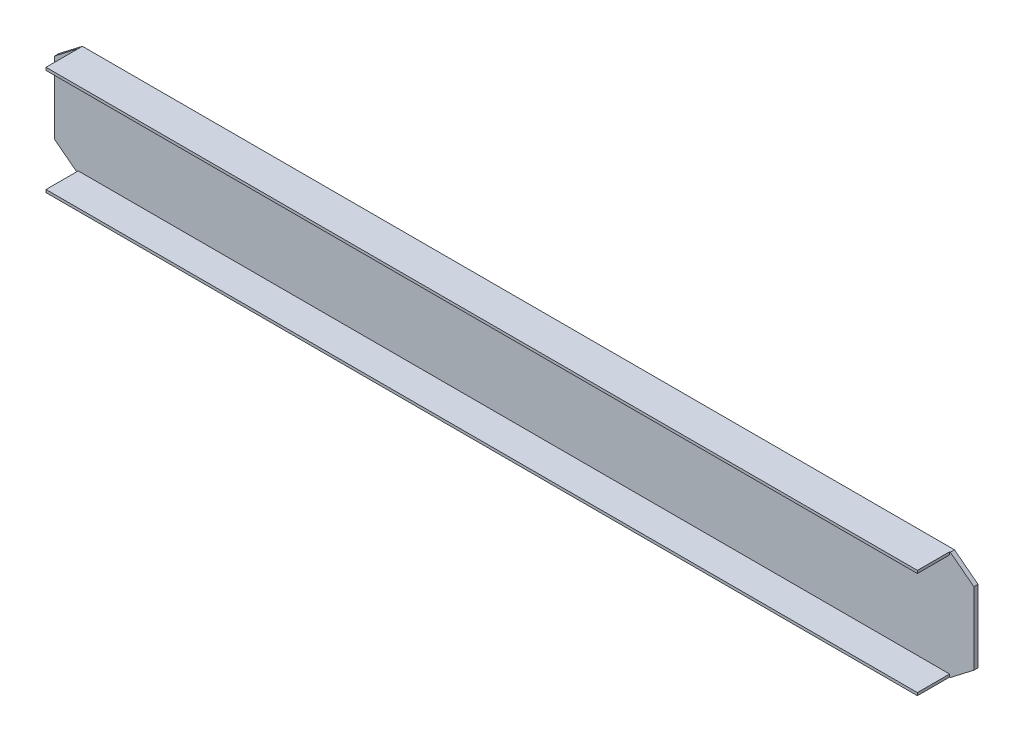
ISO-10303-21;
HEADER;
FILE_DESCRIPTION(('STEP AP214'),'2;1');
FILE_NAME('part.step','',(''),(''),'','','');
FILE_SCHEMA(('AUTOMOTIVE_DESIGN { 1 0 10303 214 1 1 1 1 }'));
ENDSEC;
DATA;
#1=APPLICATION_CONTEXT('core data for automotive mechanical design processes');
#2=APPLICATION_PROTOCOL_DEFINITION('international standard','automotive_design',2000,#1);
#3=PRODUCT_CONTEXT('',#1,'mechanical');
#4=PRODUCT('Part','Part','',(#3));
#5=PRODUCT_RELATED_PRODUCT_CATEGORY('part','',(#4));
#6=PRODUCT_DEFINITION_FORMATION('','',#4);
#7=PRODUCT_DEFINITION_CONTEXT('part definition',#1,'design');
#8=PRODUCT_DEFINITION('design','',#6,#7);
#9=PRODUCT_DEFINITION_SHAPE('','',#8);
#10=(LENGTH_UNIT() NAMED_UNIT(*) SI_UNIT(.MILLI.,.METRE.));
#11=(NAMED_UNIT(*) PLANE_ANGLE_UNIT() SI_UNIT($,.RADIAN.));
#12=(NAMED_UNIT(*) SI_UNIT($,.STERADIAN.) SOLID_ANGLE_UNIT());
#13=UNCERTAINTY_MEASURE_WITH_UNIT(LENGTH_MEASURE(1.E-05),#10,'distance_accuracy_value','');
#14=(GEOMETRIC_REPRESENTATION_CONTEXT(3) GLOBAL_UNCERTAINTY_ASSIGNED_CONTEXT((#13)) GLOBAL_UNIT_ASSIGNED_CONTEXT((#10,
#11,#12)) REPRESENTATION_CONTEXT('',''));
#15=CARTESIAN_POINT('',(0.,0.,0.));
#16=DIRECTION('',(0.,0.,1.));
#17=DIRECTION('',(1.,0.,0.));
#18=AXIS2_PLACEMENT_3D('',#15,#16,#17);
#19=CARTESIAN_POINT('',(0.,-926.923076923078,-11.5));
#20=DIRECTION('',(0.,0.,-1.));
#21=DIRECTION('',(-1.,0.,0.));
#22=AXIS2_PLACEMENT_3D('',#19,#20,#21);
#23=PLANE('',#22);
#24=DIRECTION('',(0.,-1.,0.));
#25=VECTOR('',#24,1.);
#26=CARTESIAN_POINT('',(-140.,270.,-11.5));
#27=LINE('',#26,#25);
#28=CARTESIAN_POINT('',(-140.,270.,-11.5));
#29=VERTEX_POINT('',#28);
#30=CARTESIAN_POINT('',(-140.,30.,-11.5));
#31=VERTEX_POINT('',#30);
#32=EDGE_CURVE('E265',#29,#31,#27,.T.);
#33=ORIENTED_EDGE('',*,*,#32,.F.);
#34=DIRECTION('',(1.,0.,0.));
#35=VECTOR('',#34,1.);
#36=CARTESIAN_POINT('',(-220.,270.,-11.5));
#37=LINE('',#36,#35);
#38=CARTESIAN_POINT('',(-220.,270.,-11.5));
#39=VERTEX_POINT('',#38);
#40=EDGE_CURVE('E262',#39,#29,#37,.T.);
#41=ORIENTED_EDGE('',*,*,#40,.F.);
#42=DIRECTION('',(0.,1.,0.));
#43=VECTOR('',#42,1.);
#44=CARTESIAN_POINT('',(-220.,270.,-11.5));
#45=LINE('',#44,#43);
#46=CARTESIAN_POINT('',(-220.,30.,-11.5));
#47=VERTEX_POINT('',#46);
#48=EDGE_CURVE('E274',#47,#39,#45,.T.);
#49=ORIENTED_EDGE('',*,*,#48,.F.);
#50=DIRECTION('',(-1.,0.,0.));
#51=VECTOR('',#50,1.);
#52=CARTESIAN_POINT('',(-220.,30.,-11.5));
#53=LINE('',#52,#51);
#54=EDGE_CURVE('E282',#31,#47,#53,.T.);
#55=ORIENTED_EDGE('',*,*,#54,.F.);
#56=EDGE_LOOP('',(#33,#41,#49,#55));
#57=FACE_BOUND('',#56,.T.);
#58=DIRECTION('',(-1.,0.,0.));
#59=VECTOR('',#58,1.);
#60=CARTESIAN_POINT('',(620.,30.,-11.5));
#61=LINE('',#60,#59);
#62=CARTESIAN_POINT('',(620.,30.,-11.5));
#63=VERTEX_POINT('',#62);
#64=CARTESIAN_POINT('',(540.,30.,-11.5));
#65=VERTEX_POINT('',#64);
#66=EDGE_CURVE('E336',#63,#65,#61,.T.);
#67=ORIENTED_EDGE('',*,*,#66,.F.);
#68=DIRECTION('',(0.,-1.,0.));
#69=VECTOR('',#68,1.);
#70=CARTESIAN_POINT('',(620.,270.,-11.5));
#71=LINE('',#70,#69);
#72=CARTESIAN_POINT('',(620.,270.,-11.5));
#73=VERTEX_POINT('',#72);
#74=EDGE_CURVE('E322',#73,#63,#71,.T.);
#75=ORIENTED_EDGE('',*,*,#74,.F.);
#76=DIRECTION('',(1.,0.,0.));
#77=VECTOR('',#76,1.);
#78=CARTESIAN_POINT('',(620.,270.,-11.5));
#79=LINE('',#78,#77);
#80=CARTESIAN_POINT('',(540.,270.,-11.5));
#81=VERTEX_POINT('',#80);
#82=EDGE_CURVE('E327',#81,#73,#79,.T.);
#83=ORIENTED_EDGE('',*,*,#82,.F.);
#84=DIRECTION('',(0.,1.,0.));
#85=VECTOR('',#84,1.);
#86=CARTESIAN_POINT('',(540.,270.,-11.5));
#87=LINE('',#86,#85);
#88=EDGE_CURVE('E338',#65,#81,#87,.T.);
#89=ORIENTED_EDGE('',*,*,#88,.F.);
#90=EDGE_LOOP('',(#67,#75,#83,#89));
#91=FACE_BOUND('',#90,.T.);
#92=DIRECTION('',(0.7926239891046,-0.609710760849693,0.));
#93=VECTOR('',#92,1.);
#94=CARTESIAN_POINT('',(-1270.,50.,-11.5));
#95=LINE('',#94,#93);
#96=CARTESIAN_POINT('',(-1270.,50.,-11.5));
#97=VERTEX_POINT('',#96);
#98=CARTESIAN_POINT('',(-1205.,0.,-11.5));
#99=VERTEX_POINT('',#98);
#100=EDGE_CURVE('E442',#97,#99,#95,.T.);
#101=ORIENTED_EDGE('',*,*,#100,.F.);
#102=DIRECTION('',(0.,-1.,0.));
#103=VECTOR('',#102,1.);
#104=CARTESIAN_POINT('',(-1270.,50.,-11.5));
#105=LINE('',#104,#103);
#106=CARTESIAN_POINT('',(-1270.,250.,-11.5));
#107=VERTEX_POINT('',#106);
#108=EDGE_CURVE('E457',#107,#97,#105,.T.);
#109=ORIENTED_EDGE('',*,*,#108,.F.);
#110=DIRECTION('',(-0.7926239891046,-0.609710760849693,0.));
#111=VECTOR('',#110,1.);
#112=CARTESIAN_POINT('',(-1270.,250.,-11.5));
#113=LINE('',#112,#111);
#114=CARTESIAN_POINT('',(-1205.,300.,-11.5));
#115=VERTEX_POINT('',#114);
#116=EDGE_CURVE('E463',#115,#107,#113,.T.);
#117=ORIENTED_EDGE('',*,*,#116,.F.);
#118=DIRECTION('',(-1.,0.,0.));
#119=VECTOR('',#118,1.);
#120=CARTESIAN_POINT('',(-1205.,300.,-11.5));
#121=LINE('',#120,#119);
#122=CARTESIAN_POINT('',(1205.,300.,-11.5));
#123=VERTEX_POINT('',#122);
#124=EDGE_CURVE('E428',#123,#115,#121,.T.);
#125=ORIENTED_EDGE('',*,*,#124,.F.);
#126=DIRECTION('',(-0.7926239891046,0.609710760849693,0.));
#127=VECTOR('',#126,1.);
#128=CARTESIAN_POINT('',(1270.,250.,-11.5));
#129=LINE('',#128,#127);
#130=CARTESIAN_POINT('',(1270.,250.,-11.5));
#131=VERTEX_POINT('',#130);
#132=EDGE_CURVE('E488',#131,#123,#129,.T.);
#133=ORIENTED_EDGE('',*,*,#132,.F.);
#134=DIRECTION('',(0.,1.,0.));
#135=VECTOR('',#134,1.);
#136=CARTESIAN_POINT('',(1270.,50.,-11.5));
#137=LINE('',#136,#135);
#138=CARTESIAN_POINT('',(1270.,50.,-11.5));
#139=VERTEX_POINT('',#138);
#140=EDGE_CURVE('E494',#139,#131,#137,.T.);
#141=ORIENTED_EDGE('',*,*,#140,.F.);
#142=DIRECTION('',(0.7926239891046,0.609710760849693,0.));
#143=VECTOR('',#142,1.);
#144=CARTESIAN_POINT('',(1270.,50.,-11.5));
#145=LINE('',#144,#143);
#146=CARTESIAN_POINT('',(1205.,0.,-11.5));
#147=VERTEX_POINT('',#146);
#148=EDGE_CURVE('E498',#147,#139,#145,.T.);
#149=ORIENTED_EDGE('',*,*,#148,.F.);
#150=DIRECTION('',(1.,0.,0.));
#151=VECTOR('',#150,1.);
#152=CARTESIAN_POINT('',(-1205.,0.,-11.5));
#153=LINE('',#152,#151);
#154=EDGE_CURVE('E501',#99,#147,#153,.T.);
#155=ORIENTED_EDGE('',*,*,#154,.F.);
#156=EDGE_LOOP('',(#101,#109,#117,#125,#133,#141,#149,#155));
#157=FACE_BOUND('',#156,.T.);
#158=DIRECTION('',(-1.,0.,0.));
#159=VECTOR('',#158,1.);
#160=CARTESIAN_POINT('',(220.,30.,-11.5));
#161=LINE('',#160,#159);
#162=CARTESIAN_POINT('',(220.,30.,-11.5));
#163=VERTEX_POINT('',#162);
#164=CARTESIAN_POINT('',(140.,30.,-11.5));
#165=VERTEX_POINT('',#164);
#166=EDGE_CURVE('E307',#163,#165,#161,.T.);
#167=ORIENTED_EDGE('',*,*,#166,.F.);
#168=DIRECTION('',(0.,-1.,0.));
#169=VECTOR('',#168,1.);
#170=CARTESIAN_POINT('',(220.,270.,-11.5));
#171=LINE('',#170,#169);
#172=CARTESIAN_POINT('',(220.,270.,-11.5));
#173=VERTEX_POINT('',#172);
#174=EDGE_CURVE('E293',#173,#163,#171,.T.);
#175=ORIENTED_EDGE('',*,*,#174,.F.);
#176=DIRECTION('',(1.,0.,0.));
#177=VECTOR('',#176,1.);
#178=CARTESIAN_POINT('',(220.,270.,-11.5));
#179=LINE('',#178,#177);
#180=CARTESIAN_POINT('',(140.,270.,-11.5));
#181=VERTEX_POINT('',#180);
#182=EDGE_CURVE('E298',#181,#173,#179,.T.);
#183=ORIENTED_EDGE('',*,*,#182,.F.);
#184=DIRECTION('',(0.,1.,0.));
#185=VECTOR('',#184,1.);
#186=CARTESIAN_POINT('',(140.,270.,-11.5));
#187=LINE('',#186,#185);
#188=EDGE_CURVE('E309',#165,#181,#187,.T.);
#189=ORIENTED_EDGE('',*,*,#188,.F.);
#190=EDGE_LOOP('',(#167,#175,#183,#189));
#191=FACE_BOUND('',#190,.T.);
#192=DIRECTION('',(0.,-1.,0.));
#193=VECTOR('',#192,1.);
#194=CARTESIAN_POINT('',(-540.,270.,-11.5));
#195=LINE('',#194,#193);
#196=CARTESIAN_POINT('',(-540.,270.,-11.5));
#197=VERTEX_POINT('',#196);
#198=CARTESIAN_POINT('',(-540.,30.,-11.5));
#199=VERTEX_POINT('',#198);
#200=EDGE_CURVE('E889',#197,#199,#195,.T.);
#201=ORIENTED_EDGE('',*,*,#200,.F.);
#202=DIRECTION('',(1.,0.,0.));
#203=VECTOR('',#202,1.);
#204=CARTESIAN_POINT('',(-620.,270.,-11.5));
#205=LINE('',#204,#203);
#206=CARTESIAN_POINT('',(-620.,270.,-11.5));
#207=VERTEX_POINT('',#206);
#208=EDGE_CURVE('E260',#207,#197,#205,.T.);
#209=ORIENTED_EDGE('',*,*,#208,.F.);
#210=DIRECTION('',(0.,1.,0.));
#211=VECTOR('',#210,1.);
#212=CARTESIAN_POINT('',(-620.,270.,-11.5));
#213=LINE('',#212,#211);
#214=CARTESIAN_POINT('',(-620.,30.,-11.5));
#215=VERTEX_POINT('',#214);
#216=EDGE_CURVE('E256',#215,#207,#213,.T.);
#217=ORIENTED_EDGE('',*,*,#216,.F.);
#218=DIRECTION('',(-1.,0.,0.));
#219=VECTOR('',#218,1.);
#220=CARTESIAN_POINT('',(-620.,30.,-11.5));
#221=LINE('',#220,#219);
#222=EDGE_CURVE('E886',#199,#215,#221,.T.);
#223=ORIENTED_EDGE('',*,*,#222,.F.);
#224=EDGE_LOOP('',(#201,#209,#217,#223));
#225=FACE_BOUND('',#224,.T.);
#226=ADVANCED_FACE('F32',(#57,#91,#157,#191,#225),#23,.T.);
#227=CARTESIAN_POINT('',(0.,-926.923076923078,0.));
#228=DIRECTION('',(0.,0.,-1.));
#229=DIRECTION('',(-1.,0.,0.));
#230=AXIS2_PLACEMENT_3D('',#227,#228,#229);
#231=PLANE('',#230);
#232=DIRECTION('',(0.,1.,0.));
#233=VECTOR('',#232,1.);
#234=CARTESIAN_POINT('',(1203.04903416362,0.,0.));
#235=LINE('',#234,#233);
#236=CARTESIAN_POINT('',(1203.04903416362,0.,0.));
#237=VERTEX_POINT('',#236);
#238=CARTESIAN_POINT('',(1203.04903416362,7.49999999999995,0.));
#239=VERTEX_POINT('',#238);
#240=EDGE_CURVE('E351',#237,#239,#235,.T.);
#241=ORIENTED_EDGE('',*,*,#240,.F.);
#242=DIRECTION('',(1.,0.,0.));
#243=VECTOR('',#242,1.);
#244=CARTESIAN_POINT('',(-1205.,0.,0.));
#245=LINE('',#244,#243);
#246=CARTESIAN_POINT('',(1205.,0.,0.));
#247=VERTEX_POINT('',#246);
#248=EDGE_CURVE('E472',#237,#247,#245,.T.);
#249=ORIENTED_EDGE('',*,*,#248,.T.);
#250=DIRECTION('',(0.7926239891046,0.609710760849693,0.));
#251=VECTOR('',#250,1.);
#252=CARTESIAN_POINT('',(1270.,50.,0.));
#253=LINE('',#252,#251);
#254=CARTESIAN_POINT('',(1270.,50.,0.));
#255=VERTEX_POINT('',#254);
#256=EDGE_CURVE('E474',#247,#255,#253,.T.);
#257=ORIENTED_EDGE('',*,*,#256,.T.);
#258=DIRECTION('',(0.,1.,0.));
#259=VECTOR('',#258,1.);
#260=CARTESIAN_POINT('',(1270.,50.,0.));
#261=LINE('',#260,#259);
#262=CARTESIAN_POINT('',(1270.,250.,0.));
#263=VERTEX_POINT('',#262);
#264=EDGE_CURVE('E477',#255,#263,#261,.T.);
#265=ORIENTED_EDGE('',*,*,#264,.T.);
#266=DIRECTION('',(-0.7926239891046,0.609710760849693,0.));
#267=VECTOR('',#266,1.);
#268=CARTESIAN_POINT('',(1270.,250.,0.));
#269=LINE('',#268,#267);
#270=CARTESIAN_POINT('',(1205.,300.,0.));
#271=VERTEX_POINT('',#270);
#272=EDGE_CURVE('E444',#263,#271,#269,.T.);
#273=ORIENTED_EDGE('',*,*,#272,.T.);
#274=DIRECTION('',(-1.,0.,0.));
#275=VECTOR('',#274,1.);
#276=CARTESIAN_POINT('',(-1205.,300.,0.));
#277=LINE('',#276,#275);
#278=CARTESIAN_POINT('',(1203.04903416362,300.,0.));
#279=VERTEX_POINT('',#278);
#280=EDGE_CURVE('E404',#271,#279,#277,.T.);
#281=ORIENTED_EDGE('',*,*,#280,.T.);
#282=DIRECTION('',(0.,1.,0.));
#283=VECTOR('',#282,1.);
#284=CARTESIAN_POINT('',(1203.04903416362,300.,0.));
#285=LINE('',#284,#283);
#286=CARTESIAN_POINT('',(1203.04903416362,292.5,0.));
#287=VERTEX_POINT('',#286);
#288=EDGE_CURVE('E386',#287,#279,#285,.T.);
#289=ORIENTED_EDGE('',*,*,#288,.F.);
#290=DIRECTION('',(1.,0.,0.));
#291=VECTOR('',#290,1.);
#292=CARTESIAN_POINT('',(-1205.,292.5,0.));
#293=LINE('',#292,#291);
#294=CARTESIAN_POINT('',(-1205.,292.5,0.));
#295=VERTEX_POINT('',#294);
#296=EDGE_CURVE('E395',#295,#287,#293,.T.);
#297=ORIENTED_EDGE('',*,*,#296,.F.);
#298=DIRECTION('',(0.,-1.,0.));
#299=VECTOR('',#298,1.);
#300=CARTESIAN_POINT('',(-1205.,300.,0.));
#301=LINE('',#300,#299);
#302=CARTESIAN_POINT('',(-1205.,300.,0.));
#303=VERTEX_POINT('',#302);
#304=EDGE_CURVE('E381',#303,#295,#301,.T.);
#305=ORIENTED_EDGE('',*,*,#304,.F.);
#306=DIRECTION('',(-0.7926239891046,-0.609710760849693,0.));
#307=VECTOR('',#306,1.);
#308=CARTESIAN_POINT('',(-1270.,250.,0.));
#309=LINE('',#308,#307);
#310=CARTESIAN_POINT('',(-1270.,250.,0.));
#311=VERTEX_POINT('',#310);
#312=EDGE_CURVE('E435',#303,#311,#309,.T.);
#313=ORIENTED_EDGE('',*,*,#312,.T.);
#314=DIRECTION('',(0.,-1.,0.));
#315=VECTOR('',#314,1.);
#316=CARTESIAN_POINT('',(-1270.,50.,0.));
#317=LINE('',#316,#315);
#318=CARTESIAN_POINT('',(-1270.,50.,0.));
#319=VERTEX_POINT('',#318);
#320=EDGE_CURVE('E440',#311,#319,#317,.T.);
#321=ORIENTED_EDGE('',*,*,#320,.T.);
#322=DIRECTION('',(0.7926239891046,-0.609710760849693,0.));
#323=VECTOR('',#322,1.);
#324=CARTESIAN_POINT('',(-1270.,50.,0.));
#325=LINE('',#324,#323);
#326=CARTESIAN_POINT('',(-1205.,0.,0.));
#327=VERTEX_POINT('',#326);
#328=EDGE_CURVE('E470',#319,#327,#325,.T.);
#329=ORIENTED_EDGE('',*,*,#328,.T.);
#330=DIRECTION('',(0.,-1.,0.));
#331=VECTOR('',#330,1.);
#332=CARTESIAN_POINT('',(-1205.,0.,0.));
#333=LINE('',#332,#331);
#334=CARTESIAN_POINT('',(-1205.,7.49999999999995,0.));
#335=VERTEX_POINT('',#334);
#336=EDGE_CURVE('E356',#335,#327,#333,.T.);
#337=ORIENTED_EDGE('',*,*,#336,.F.);
#338=DIRECTION('',(-1.,0.,0.));
#339=VECTOR('',#338,1.);
#340=CARTESIAN_POINT('',(-1205.,7.49999999999995,0.));
#341=LINE('',#340,#339);
#342=EDGE_CURVE('E365',#239,#335,#341,.T.);
#343=ORIENTED_EDGE('',*,*,#342,.F.);
#344=EDGE_LOOP('',(#241,#249,#257,#265,#273,#281,#289,#297,#305,#313,#321,#329,#337,#343));
#345=FACE_BOUND('',#344,.T.);
#346=ADVANCED_FACE('F482',(#345),#231,.F.);
#347=CARTESIAN_POINT('',(-1270.,50.,-11.5));
#348=DIRECTION('',(-0.609710760849693,-0.7926239891046,0.));
#349=DIRECTION('',(0.7926239891046,-0.609710760849693,0.));
#350=AXIS2_PLACEMENT_3D('',#347,#348,#349);
#351=PLANE('',#350);
#352=ORIENTED_EDGE('',*,*,#328,.F.);
#353=DIRECTION('',(0.,0.,1.));
#354=VECTOR('',#353,1.);
#355=CARTESIAN_POINT('',(-1270.,50.,-11.5));
#356=LINE('',#355,#354);
#357=EDGE_CURVE('E11',#97,#319,#356,.T.);
#358=ORIENTED_EDGE('',*,*,#357,.F.);
#359=ORIENTED_EDGE('',*,*,#100,.T.);
#360=DIRECTION('',(0.,0.,1.));
#361=VECTOR('',#360,1.);
#362=CARTESIAN_POINT('',(-1205.,0.,-11.5));
#363=LINE('',#362,#361);
#364=EDGE_CURVE('E456',#99,#327,#363,.T.);
#365=ORIENTED_EDGE('',*,*,#364,.T.);
#366=EDGE_LOOP('',(#352,#358,#359,#365));
#367=FACE_BOUND('',#366,.T.);
#368=ADVANCED_FACE('F34',(#367),#351,.T.);
#369=CARTESIAN_POINT('',(-1270.,50.,-11.5));
#370=DIRECTION('',(-1.,0.,0.));
#371=DIRECTION('',(0.,0.,1.));
#372=AXIS2_PLACEMENT_3D('',#369,#370,#371);
#373=PLANE('',#372);
#374=ORIENTED_EDGE('',*,*,#320,.F.);
#375=DIRECTION('',(0.,0.,1.));
#376=VECTOR('',#375,1.);
#377=CARTESIAN_POINT('',(-1270.,250.,-11.5));
#378=LINE('',#377,#376);
#379=EDGE_CURVE('E41',#107,#311,#378,.T.);
#380=ORIENTED_EDGE('',*,*,#379,.F.);
#381=ORIENTED_EDGE('',*,*,#108,.T.);
#382=ORIENTED_EDGE('',*,*,#357,.T.);
#383=EDGE_LOOP('',(#374,#380,#381,#382));
#384=FACE_BOUND('',#383,.T.);
#385=ADVANCED_FACE('F534',(#384),#373,.T.);
#386=CARTESIAN_POINT('',(-1270.,250.,-11.5));
#387=DIRECTION('',(-0.609710760849693,0.7926239891046,0.));
#388=DIRECTION('',(-0.7926239891046,-0.609710760849693,0.));
#389=AXIS2_PLACEMENT_3D('',#386,#387,#388);
#390=PLANE('',#389);
#391=ORIENTED_EDGE('',*,*,#312,.F.);
#392=DIRECTION('',(0.,0.,1.));
#393=VECTOR('',#392,1.);
#394=CARTESIAN_POINT('',(-1205.,300.,-11.5));
#395=LINE('',#394,#393);
#396=EDGE_CURVE('E425',#115,#303,#395,.T.);
#397=ORIENTED_EDGE('',*,*,#396,.F.);
#398=ORIENTED_EDGE('',*,*,#116,.T.);
#399=ORIENTED_EDGE('',*,*,#379,.T.);
#400=EDGE_LOOP('',(#391,#397,#398,#399));
#401=FACE_BOUND('',#400,.T.);
#402=ADVANCED_FACE('F436',(#401),#390,.T.);
#403=CARTESIAN_POINT('',(-1205.,300.,-11.5));
#404=DIRECTION('',(0.,1.,0.));
#405=DIRECTION('',(0.,0.,1.));
#406=AXIS2_PLACEMENT_3D('',#403,#404,#405);
#407=PLANE('',#406);
#408=ORIENTED_EDGE('',*,*,#280,.F.);
#409=DIRECTION('',(0.,0.,1.));
#410=VECTOR('',#409,1.);
#411=CARTESIAN_POINT('',(1205.,300.,-11.5));
#412=LINE('',#411,#410);
#413=EDGE_CURVE('E432',#123,#271,#412,.T.);
#414=ORIENTED_EDGE('',*,*,#413,.F.);
#415=ORIENTED_EDGE('',*,*,#124,.T.);
#416=ORIENTED_EDGE('',*,*,#396,.T.);
#417=DIRECTION('',(0.,0.,-1.));
#418=VECTOR('',#417,1.);
#419=CARTESIAN_POINT('',(-1205.,300.,89.));
#420=LINE('',#419,#418);
#421=CARTESIAN_POINT('',(-1205.,300.,89.));
#422=VERTEX_POINT('',#421);
#423=EDGE_CURVE('E392',#422,#303,#420,.T.);
#424=ORIENTED_EDGE('',*,*,#423,.F.);
#425=DIRECTION('',(-1.,0.,0.));
#426=VECTOR('',#425,1.);
#427=CARTESIAN_POINT('',(-1205.,300.,89.));
#428=LINE('',#427,#426);
#429=CARTESIAN_POINT('',(1203.04903416362,300.,89.));
#430=VERTEX_POINT('',#429);
#431=EDGE_CURVE('E390',#430,#422,#428,.T.);
#432=ORIENTED_EDGE('',*,*,#431,.F.);
#433=DIRECTION('',(0.,0.,-1.));
#434=VECTOR('',#433,1.);
#435=CARTESIAN_POINT('',(1203.04903416362,300.,89.));
#436=LINE('',#435,#434);
#437=EDGE_CURVE('E407',#430,#279,#436,.T.);
#438=ORIENTED_EDGE('',*,*,#437,.T.);
#439=EDGE_LOOP('',(#408,#414,#415,#416,#424,#432,#438));
#440=FACE_BOUND('',#439,.T.);
#441=ADVANCED_FACE('F423',(#440),#407,.T.);
#442=CARTESIAN_POINT('',(1270.,250.,-11.5));
#443=DIRECTION('',(0.609710760849693,0.7926239891046,0.));
#444=DIRECTION('',(-0.7926239891046,0.609710760849693,0.));
#445=AXIS2_PLACEMENT_3D('',#442,#443,#444);
#446=PLANE('',#445);
#447=ORIENTED_EDGE('',*,*,#272,.F.);
#448=DIRECTION('',(0.,0.,1.));
#449=VECTOR('',#448,1.);
#450=CARTESIAN_POINT('',(1270.,250.,-11.5));
#451=LINE('',#450,#449);
#452=EDGE_CURVE('E450',#131,#263,#451,.T.);
#453=ORIENTED_EDGE('',*,*,#452,.F.);
#454=ORIENTED_EDGE('',*,*,#132,.T.);
#455=ORIENTED_EDGE('',*,*,#413,.T.);
#456=EDGE_LOOP('',(#447,#453,#454,#455));
#457=FACE_BOUND('',#456,.T.);
#458=ADVANCED_FACE('F485',(#457),#446,.T.);
#459=CARTESIAN_POINT('',(1270.,50.,-11.5));
#460=DIRECTION('',(1.,0.,0.));
#461=DIRECTION('',(0.,0.,-1.));
#462=AXIS2_PLACEMENT_3D('',#459,#460,#461);
#463=PLANE('',#462);
#464=ORIENTED_EDGE('',*,*,#264,.F.);
#465=DIRECTION('',(0.,0.,1.));
#466=VECTOR('',#465,1.);
#467=CARTESIAN_POINT('',(1270.,50.,-11.5));
#468=LINE('',#467,#466);
#469=EDGE_CURVE('E452',#139,#255,#468,.T.);
#470=ORIENTED_EDGE('',*,*,#469,.F.);
#471=ORIENTED_EDGE('',*,*,#140,.T.);
#472=ORIENTED_EDGE('',*,*,#452,.T.);
#473=EDGE_LOOP('',(#464,#470,#471,#472));
#474=FACE_BOUND('',#473,.T.);
#475=ADVANCED_FACE('F543',(#474),#463,.T.);
#476=CARTESIAN_POINT('',(1270.,50.,-11.5));
#477=DIRECTION('',(0.609710760849693,-0.7926239891046,0.));
#478=DIRECTION('',(0.7926239891046,0.609710760849693,0.));
#479=AXIS2_PLACEMENT_3D('',#476,#477,#478);
#480=PLANE('',#479);
#481=ORIENTED_EDGE('',*,*,#256,.F.);
#482=DIRECTION('',(0.,0.,1.));
#483=VECTOR('',#482,1.);
#484=CARTESIAN_POINT('',(1205.,0.,-11.5));
#485=LINE('',#484,#483);
#486=EDGE_CURVE('E454',#147,#247,#485,.T.);
#487=ORIENTED_EDGE('',*,*,#486,.F.);
#488=ORIENTED_EDGE('',*,*,#148,.T.);
#489=ORIENTED_EDGE('',*,*,#469,.T.);
#490=EDGE_LOOP('',(#481,#487,#488,#489));
#491=FACE_BOUND('',#490,.T.);
#492=ADVANCED_FACE('F546',(#491),#480,.T.);
#493=CARTESIAN_POINT('',(-1205.,0.,-11.5));
#494=DIRECTION('',(0.,-1.,0.));
#495=DIRECTION('',(0.,0.,-1.));
#496=AXIS2_PLACEMENT_3D('',#493,#494,#495);
#497=PLANE('',#496);
#498=ORIENTED_EDGE('',*,*,#248,.F.);
#499=DIRECTION('',(0.,0.,-1.));
#500=VECTOR('',#499,1.);
#501=CARTESIAN_POINT('',(1203.04903416362,0.,89.));
#502=LINE('',#501,#500);
#503=CARTESIAN_POINT('',(1203.04903416362,0.,89.));
#504=VERTEX_POINT('',#503);
#505=EDGE_CURVE('E378',#504,#237,#502,.T.);
#506=ORIENTED_EDGE('',*,*,#505,.F.);
#507=DIRECTION('',(1.,0.,0.));
#508=VECTOR('',#507,1.);
#509=CARTESIAN_POINT('',(-1205.,0.,89.));
#510=LINE('',#509,#508);
#511=CARTESIAN_POINT('',(-1205.,0.,89.));
#512=VERTEX_POINT('',#511);
#513=EDGE_CURVE('E352',#512,#504,#510,.T.);
#514=ORIENTED_EDGE('',*,*,#513,.F.);
#515=DIRECTION('',(0.,0.,-1.));
#516=VECTOR('',#515,1.);
#517=CARTESIAN_POINT('',(-1205.,0.,89.));
#518=LINE('',#517,#516);
#519=EDGE_CURVE('E362',#512,#327,#518,.T.);
#520=ORIENTED_EDGE('',*,*,#519,.T.);
#521=ORIENTED_EDGE('',*,*,#364,.F.);
#522=ORIENTED_EDGE('',*,*,#154,.T.);
#523=ORIENTED_EDGE('',*,*,#486,.T.);
#524=EDGE_LOOP('',(#498,#506,#514,#520,#521,#522,#523));
#525=FACE_BOUND('',#524,.T.);
#526=ADVANCED_FACE('F549',(#525),#497,.T.);
#527=CARTESIAN_POINT('',(-1205.,300.,89.));
#528=DIRECTION('',(1.,0.,0.));
#529=DIRECTION('',(0.,0.,-1.));
#530=AXIS2_PLACEMENT_3D('',#527,#528,#529);
#531=PLANE('',#530);
#532=ORIENTED_EDGE('',*,*,#304,.T.);
#533=DIRECTION('',(0.,0.,-1.));
#534=VECTOR('',#533,1.);
#535=CARTESIAN_POINT('',(-1205.,292.5,89.));
#536=LINE('',#535,#534);
#537=CARTESIAN_POINT('',(-1205.,292.5,89.));
#538=VERTEX_POINT('',#537);
#539=EDGE_CURVE('E415',#538,#295,#536,.T.);
#540=ORIENTED_EDGE('',*,*,#539,.F.);
#541=DIRECTION('',(0.,-1.,0.));
#542=VECTOR('',#541,1.);
#543=CARTESIAN_POINT('',(-1205.,300.,89.));
#544=LINE('',#543,#542);
#545=EDGE_CURVE('E382',#422,#538,#544,.T.);
#546=ORIENTED_EDGE('',*,*,#545,.F.);
#547=ORIENTED_EDGE('',*,*,#423,.T.);
#548=EDGE_LOOP('',(#532,#540,#546,#547));
#549=FACE_BOUND('',#548,.T.);
#550=ADVANCED_FACE('F420',(#549),#531,.F.);
#551=CARTESIAN_POINT('',(-1205.,292.5,89.));
#552=DIRECTION('',(0.,1.,0.));
#553=DIRECTION('',(0.,0.,1.));
#554=AXIS2_PLACEMENT_3D('',#551,#552,#553);
#555=PLANE('',#554);
#556=ORIENTED_EDGE('',*,*,#296,.T.);
#557=DIRECTION('',(0.,0.,-1.));
#558=VECTOR('',#557,1.);
#559=CARTESIAN_POINT('',(1203.04903416362,292.5,89.));
#560=LINE('',#559,#558);
#561=CARTESIAN_POINT('',(1203.04903416362,292.5,89.));
#562=VERTEX_POINT('',#561);
#563=EDGE_CURVE('E409',#562,#287,#560,.T.);
#564=ORIENTED_EDGE('',*,*,#563,.F.);
#565=DIRECTION('',(1.,0.,0.));
#566=VECTOR('',#565,1.);
#567=CARTESIAN_POINT('',(-1205.,292.5,89.));
#568=LINE('',#567,#566);
#569=EDGE_CURVE('E385',#538,#562,#568,.T.);
#570=ORIENTED_EDGE('',*,*,#569,.F.);
#571=ORIENTED_EDGE('',*,*,#539,.T.);
#572=EDGE_LOOP('',(#556,#564,#570,#571));
#573=FACE_BOUND('',#572,.T.);
#574=ADVANCED_FACE('F507',(#573),#555,.F.);
#575=CARTESIAN_POINT('',(1203.04903416362,300.,89.));
#576=DIRECTION('',(-1.,0.,0.));
#577=DIRECTION('',(0.,0.,1.));
#578=AXIS2_PLACEMENT_3D('',#575,#576,#577);
#579=PLANE('',#578);
#580=ORIENTED_EDGE('',*,*,#288,.T.);
#581=ORIENTED_EDGE('',*,*,#437,.F.);
#582=DIRECTION('',(0.,1.,0.));
#583=VECTOR('',#582,1.);
#584=CARTESIAN_POINT('',(1203.04903416362,300.,89.));
#585=LINE('',#584,#583);
#586=EDGE_CURVE('E388',#562,#430,#585,.T.);
#587=ORIENTED_EDGE('',*,*,#586,.F.);
#588=ORIENTED_EDGE('',*,*,#563,.T.);
#589=EDGE_LOOP('',(#580,#581,#587,#588));
#590=FACE_BOUND('',#589,.T.);
#591=ADVANCED_FACE('F513',(#590),#579,.F.);
#592=CARTESIAN_POINT('',(-1205.,292.5,89.));
#593=DIRECTION('',(0.,0.,1.));
#594=DIRECTION('',(1.,0.,0.));
#595=AXIS2_PLACEMENT_3D('',#592,#593,#594);
#596=PLANE('',#595);
#597=ORIENTED_EDGE('',*,*,#545,.T.);
#598=ORIENTED_EDGE('',*,*,#569,.T.);
#599=ORIENTED_EDGE('',*,*,#586,.T.);
#600=ORIENTED_EDGE('',*,*,#431,.T.);
#601=EDGE_LOOP('',(#597,#598,#599,#600));
#602=FACE_BOUND('',#601,.T.);
#603=ADVANCED_FACE('F511',(#602),#596,.T.);
#604=CARTESIAN_POINT('',(1203.04903416362,0.,89.));
#605=DIRECTION('',(-1.,0.,0.));
#606=DIRECTION('',(0.,0.,1.));
#607=AXIS2_PLACEMENT_3D('',#604,#605,#606);
#608=PLANE('',#607);
#609=ORIENTED_EDGE('',*,*,#240,.T.);
#610=DIRECTION('',(0.,0.,-1.));
#611=VECTOR('',#610,1.);
#612=CARTESIAN_POINT('',(1203.04903416362,7.49999999999995,89.));
#613=LINE('',#612,#611);
#614=CARTESIAN_POINT('',(1203.04903416362,7.49999999999995,89.));
#615=VERTEX_POINT('',#614);
#616=EDGE_CURVE('E375',#615,#239,#613,.T.);
#617=ORIENTED_EDGE('',*,*,#616,.F.);
#618=DIRECTION('',(0.,1.,0.));
#619=VECTOR('',#618,1.);
#620=CARTESIAN_POINT('',(1203.04903416362,0.,89.));
#621=LINE('',#620,#619);
#622=EDGE_CURVE('E355',#504,#615,#621,.T.);
#623=ORIENTED_EDGE('',*,*,#622,.F.);
#624=ORIENTED_EDGE('',*,*,#505,.T.);
#625=EDGE_LOOP('',(#609,#617,#623,#624));
#626=FACE_BOUND('',#625,.T.);
#627=ADVANCED_FACE('F520',(#626),#608,.F.);
#628=CARTESIAN_POINT('',(-1205.,7.49999999999995,89.));
#629=DIRECTION('',(0.,-1.,0.));
#630=DIRECTION('',(0.,0.,-1.));
#631=AXIS2_PLACEMENT_3D('',#628,#629,#630);
#632=PLANE('',#631);
#633=ORIENTED_EDGE('',*,*,#342,.T.);
#634=DIRECTION('',(0.,0.,-1.));
#635=VECTOR('',#634,1.);
#636=CARTESIAN_POINT('',(-1205.,7.49999999999995,89.));
#637=LINE('',#636,#635);
#638=CARTESIAN_POINT('',(-1205.,7.49999999999995,89.));
#639=VERTEX_POINT('',#638);
#640=EDGE_CURVE('E372',#639,#335,#637,.T.);
#641=ORIENTED_EDGE('',*,*,#640,.F.);
#642=DIRECTION('',(-1.,0.,0.));
#643=VECTOR('',#642,1.);
#644=CARTESIAN_POINT('',(-1205.,7.49999999999995,89.));
#645=LINE('',#644,#643);
#646=EDGE_CURVE('E358',#615,#639,#645,.T.);
#647=ORIENTED_EDGE('',*,*,#646,.F.);
#648=ORIENTED_EDGE('',*,*,#616,.T.);
#649=EDGE_LOOP('',(#633,#641,#647,#648));
#650=FACE_BOUND('',#649,.T.);
#651=ADVANCED_FACE('F571',(#650),#632,.F.);
#652=CARTESIAN_POINT('',(-1205.,0.,89.));
#653=DIRECTION('',(1.,0.,0.));
#654=DIRECTION('',(0.,0.,-1.));
#655=AXIS2_PLACEMENT_3D('',#652,#653,#654);
#656=PLANE('',#655);
#657=ORIENTED_EDGE('',*,*,#336,.T.);
#658=ORIENTED_EDGE('',*,*,#519,.F.);
#659=DIRECTION('',(0.,-1.,0.));
#660=VECTOR('',#659,1.);
#661=CARTESIAN_POINT('',(-1205.,0.,89.));
#662=LINE('',#661,#660);
#663=EDGE_CURVE('E360',#639,#512,#662,.T.);
#664=ORIENTED_EDGE('',*,*,#663,.F.);
#665=ORIENTED_EDGE('',*,*,#640,.T.);
#666=EDGE_LOOP('',(#657,#658,#664,#665));
#667=FACE_BOUND('',#666,.T.);
#668=ADVANCED_FACE('F568',(#667),#656,.F.);
#669=CARTESIAN_POINT('',(1203.04903416362,0.,89.));
#670=DIRECTION('',(0.,0.,1.));
#671=DIRECTION('',(1.,0.,0.));
#672=AXIS2_PLACEMENT_3D('',#669,#670,#671);
#673=PLANE('',#672);
#674=ORIENTED_EDGE('',*,*,#513,.T.);
#675=ORIENTED_EDGE('',*,*,#622,.T.);
#676=ORIENTED_EDGE('',*,*,#646,.T.);
#677=ORIENTED_EDGE('',*,*,#663,.T.);
#678=EDGE_LOOP('',(#674,#675,#676,#677));
#679=FACE_BOUND('',#678,.T.);
#680=ADVANCED_FACE('F563',(#679),#673,.T.);
#681=CARTESIAN_POINT('',(620.,270.,-27.5));
#682=DIRECTION('',(-1.,0.,0.));
#683=DIRECTION('',(0.,0.,1.));
#684=AXIS2_PLACEMENT_3D('',#681,#682,#683);
#685=PLANE('',#684);
#686=ORIENTED_EDGE('',*,*,#74,.T.);
#687=DIRECTION('',(0.,0.,1.));
#688=VECTOR('',#687,1.);
#689=CARTESIAN_POINT('',(620.,30.,-27.5));
#690=LINE('',#689,#688);
#691=CARTESIAN_POINT('',(620.,30.,-27.5));
#692=VERTEX_POINT('',#691);
#693=EDGE_CURVE('E349',#692,#63,#690,.T.);
#694=ORIENTED_EDGE('',*,*,#693,.F.);
#695=DIRECTION('',(0.,-1.,0.));
#696=VECTOR('',#695,1.);
#697=CARTESIAN_POINT('',(620.,270.,-27.5));
#698=LINE('',#697,#696);
#699=CARTESIAN_POINT('',(620.,270.,-27.5));
#700=VERTEX_POINT('',#699);
#701=EDGE_CURVE('E323',#700,#692,#698,.T.);
#702=ORIENTED_EDGE('',*,*,#701,.F.);
#703=DIRECTION('',(0.,0.,1.));
#704=VECTOR('',#703,1.);
#705=CARTESIAN_POINT('',(620.,270.,-27.5));
#706=LINE('',#705,#704);
#707=EDGE_CURVE('E333',#700,#73,#706,.T.);
#708=ORIENTED_EDGE('',*,*,#707,.T.);
#709=EDGE_LOOP('',(#686,#694,#702,#708));
#710=FACE_BOUND('',#709,.T.);
#711=ADVANCED_FACE('F583',(#710),#685,.F.);
#712=CARTESIAN_POINT('',(620.,30.,-27.5));
#713=DIRECTION('',(0.,1.,0.));
#714=DIRECTION('',(-1.,0.,0.));
#715=AXIS2_PLACEMENT_3D('',#712,#713,#714);
#716=PLANE('',#715);
#717=ORIENTED_EDGE('',*,*,#66,.T.);
#718=DIRECTION('',(0.,0.,1.));
#719=VECTOR('',#718,1.);
#720=CARTESIAN_POINT('',(540.,30.,-27.5));
#721=LINE('',#720,#719);
#722=CARTESIAN_POINT('',(540.,30.,-27.5));
#723=VERTEX_POINT('',#722);
#724=EDGE_CURVE('E346',#723,#65,#721,.T.);
#725=ORIENTED_EDGE('',*,*,#724,.F.);
#726=DIRECTION('',(-1.,0.,0.));
#727=VECTOR('',#726,1.);
#728=CARTESIAN_POINT('',(620.,30.,-27.5));
#729=LINE('',#728,#727);
#730=EDGE_CURVE('E326',#692,#723,#729,.T.);
#731=ORIENTED_EDGE('',*,*,#730,.F.);
#732=ORIENTED_EDGE('',*,*,#693,.T.);
#733=EDGE_LOOP('',(#717,#725,#731,#732));
#734=FACE_BOUND('',#733,.T.);
#735=ADVANCED_FACE('F586',(#734),#716,.F.);
#736=CARTESIAN_POINT('',(540.,270.,-27.5));
#737=DIRECTION('',(1.,0.,0.));
#738=DIRECTION('',(0.,1.,0.));
#739=AXIS2_PLACEMENT_3D('',#736,#737,#738);
#740=PLANE('',#739);
#741=ORIENTED_EDGE('',*,*,#88,.T.);
#742=DIRECTION('',(0.,0.,1.));
#743=VECTOR('',#742,1.);
#744=CARTESIAN_POINT('',(540.,270.,-27.5));
#745=LINE('',#744,#743);
#746=CARTESIAN_POINT('',(540.,270.,-27.5));
#747=VERTEX_POINT('',#746);
#748=EDGE_CURVE('E344',#747,#81,#745,.T.);
#749=ORIENTED_EDGE('',*,*,#748,.F.);
#750=DIRECTION('',(0.,1.,0.));
#751=VECTOR('',#750,1.);
#752=CARTESIAN_POINT('',(540.,270.,-27.5));
#753=LINE('',#752,#751);
#754=EDGE_CURVE('E329',#723,#747,#753,.T.);
#755=ORIENTED_EDGE('',*,*,#754,.F.);
#756=ORIENTED_EDGE('',*,*,#724,.T.);
#757=EDGE_LOOP('',(#741,#749,#755,#756));
#758=FACE_BOUND('',#757,.T.);
#759=ADVANCED_FACE('F590',(#758),#740,.F.);
#760=CARTESIAN_POINT('',(620.,270.,-27.5));
#761=DIRECTION('',(0.,-1.,0.));
#762=DIRECTION('',(0.,0.,-1.));
#763=AXIS2_PLACEMENT_3D('',#760,#761,#762);
#764=PLANE('',#763);
#765=ORIENTED_EDGE('',*,*,#82,.T.);
#766=ORIENTED_EDGE('',*,*,#707,.F.);
#767=DIRECTION('',(1.,0.,0.));
#768=VECTOR('',#767,1.);
#769=CARTESIAN_POINT('',(620.,270.,-27.5));
#770=LINE('',#769,#768);
#771=EDGE_CURVE('E331',#747,#700,#770,.T.);
#772=ORIENTED_EDGE('',*,*,#771,.F.);
#773=ORIENTED_EDGE('',*,*,#748,.T.);
#774=EDGE_LOOP('',(#765,#766,#772,#773));
#775=FACE_BOUND('',#774,.T.);
#776=ADVANCED_FACE('F594',(#775),#764,.F.);
#777=CARTESIAN_POINT('',(620.,270.,-27.5));
#778=DIRECTION('',(0.,0.,-1.));
#779=DIRECTION('',(-1.,0.,0.));
#780=AXIS2_PLACEMENT_3D('',#777,#778,#779);
#781=PLANE('',#780);
#782=ORIENTED_EDGE('',*,*,#701,.T.);
#783=ORIENTED_EDGE('',*,*,#730,.T.);
#784=ORIENTED_EDGE('',*,*,#754,.T.);
#785=ORIENTED_EDGE('',*,*,#771,.T.);
#786=EDGE_LOOP('',(#782,#783,#784,#785));
#787=FACE_BOUND('',#786,.T.);
#788=ADVANCED_FACE('F598',(#787),#781,.T.);
#789=CARTESIAN_POINT('',(220.,270.,-27.5));
#790=DIRECTION('',(-1.,0.,0.));
#791=DIRECTION('',(0.,-1.,0.));
#792=AXIS2_PLACEMENT_3D('',#789,#790,#791);
#793=PLANE('',#792);
#794=ORIENTED_EDGE('',*,*,#174,.T.);
#795=DIRECTION('',(0.,0.,1.));
#796=VECTOR('',#795,1.);
#797=CARTESIAN_POINT('',(220.,30.,-27.5));
#798=LINE('',#797,#796);
#799=CARTESIAN_POINT('',(220.,30.,-27.5));
#800=VERTEX_POINT('',#799);
#801=EDGE_CURVE('E320',#800,#163,#798,.T.);
#802=ORIENTED_EDGE('',*,*,#801,.F.);
#803=DIRECTION('',(0.,-1.,0.));
#804=VECTOR('',#803,1.);
#805=CARTESIAN_POINT('',(220.,270.,-27.5));
#806=LINE('',#805,#804);
#807=CARTESIAN_POINT('',(220.,270.,-27.5));
#808=VERTEX_POINT('',#807);
#809=EDGE_CURVE('E294',#808,#800,#806,.T.);
#810=ORIENTED_EDGE('',*,*,#809,.F.);
#811=DIRECTION('',(0.,0.,1.));
#812=VECTOR('',#811,1.);
#813=CARTESIAN_POINT('',(220.,270.,-27.5));
#814=LINE('',#813,#812);
#815=EDGE_CURVE('E304',#808,#173,#814,.T.);
#816=ORIENTED_EDGE('',*,*,#815,.T.);
#817=EDGE_LOOP('',(#794,#802,#810,#816));
#818=FACE_BOUND('',#817,.T.);
#819=ADVANCED_FACE('F602',(#818),#793,.F.);
#820=CARTESIAN_POINT('',(220.,30.,-27.5));
#821=DIRECTION('',(0.,1.,0.));
#822=DIRECTION('',(-1.,0.,0.));
#823=AXIS2_PLACEMENT_3D('',#820,#821,#822);
#824=PLANE('',#823);
#825=ORIENTED_EDGE('',*,*,#166,.T.);
#826=DIRECTION('',(0.,0.,1.));
#827=VECTOR('',#826,1.);
#828=CARTESIAN_POINT('',(140.,30.,-27.5));
#829=LINE('',#828,#827);
#830=CARTESIAN_POINT('',(140.,30.,-27.5));
#831=VERTEX_POINT('',#830);
#832=EDGE_CURVE('E317',#831,#165,#829,.T.);
#833=ORIENTED_EDGE('',*,*,#832,.F.);
#834=DIRECTION('',(-1.,0.,0.));
#835=VECTOR('',#834,1.);
#836=CARTESIAN_POINT('',(220.,30.,-27.5));
#837=LINE('',#836,#835);
#838=EDGE_CURVE('E297',#800,#831,#837,.T.);
#839=ORIENTED_EDGE('',*,*,#838,.F.);
#840=ORIENTED_EDGE('',*,*,#801,.T.);
#841=EDGE_LOOP('',(#825,#833,#839,#840));
#842=FACE_BOUND('',#841,.T.);
#843=ADVANCED_FACE('F606',(#842),#824,.F.);
#844=CARTESIAN_POINT('',(140.,270.,-27.5));
#845=DIRECTION('',(1.,0.,0.));
#846=DIRECTION('',(0.,0.,-1.));
#847=AXIS2_PLACEMENT_3D('',#844,#845,#846);
#848=PLANE('',#847);
#849=ORIENTED_EDGE('',*,*,#188,.T.);
#850=DIRECTION('',(0.,0.,1.));
#851=VECTOR('',#850,1.);
#852=CARTESIAN_POINT('',(140.,270.,-27.5));
#853=LINE('',#852,#851);
#854=CARTESIAN_POINT('',(140.,270.,-27.5));
#855=VERTEX_POINT('',#854);
#856=EDGE_CURVE('E315',#855,#181,#853,.T.);
#857=ORIENTED_EDGE('',*,*,#856,.F.);
#858=DIRECTION('',(0.,1.,0.));
#859=VECTOR('',#858,1.);
#860=CARTESIAN_POINT('',(140.,270.,-27.5));
#861=LINE('',#860,#859);
#862=EDGE_CURVE('E300',#831,#855,#861,.T.);
#863=ORIENTED_EDGE('',*,*,#862,.F.);
#864=ORIENTED_EDGE('',*,*,#832,.T.);
#865=EDGE_LOOP('',(#849,#857,#863,#864));
#866=FACE_BOUND('',#865,.T.);
#867=ADVANCED_FACE('F610',(#866),#848,.F.);
#868=CARTESIAN_POINT('',(220.,270.,-27.5));
#869=DIRECTION('',(0.,-1.,0.));
#870=DIRECTION('',(0.,0.,-1.));
#871=AXIS2_PLACEMENT_3D('',#868,#869,#870);
#872=PLANE('',#871);
#873=ORIENTED_EDGE('',*,*,#182,.T.);
#874=ORIENTED_EDGE('',*,*,#815,.F.);
#875=DIRECTION('',(1.,0.,0.));
#876=VECTOR('',#875,1.);
#877=CARTESIAN_POINT('',(220.,270.,-27.5));
#878=LINE('',#877,#876);
#879=EDGE_CURVE('E302',#855,#808,#878,.T.);
#880=ORIENTED_EDGE('',*,*,#879,.F.);
#881=ORIENTED_EDGE('',*,*,#856,.T.);
#882=EDGE_LOOP('',(#873,#874,#880,#881));
#883=FACE_BOUND('',#882,.T.);
#884=ADVANCED_FACE('F614',(#883),#872,.F.);
#885=CARTESIAN_POINT('',(220.,30.,-27.5));
#886=DIRECTION('',(0.,0.,-1.));
#887=DIRECTION('',(-1.,0.,0.));
#888=AXIS2_PLACEMENT_3D('',#885,#886,#887);
#889=PLANE('',#888);
#890=ORIENTED_EDGE('',*,*,#809,.T.);
#891=ORIENTED_EDGE('',*,*,#838,.T.);
#892=ORIENTED_EDGE('',*,*,#862,.T.);
#893=ORIENTED_EDGE('',*,*,#879,.T.);
#894=EDGE_LOOP('',(#890,#891,#892,#893));
#895=FACE_BOUND('',#894,.T.);
#896=ADVANCED_FACE('F618',(#895),#889,.T.);
#897=CARTESIAN_POINT('',(-220.,270.,-27.5));
#898=DIRECTION('',(0.,-1.,0.));
#899=DIRECTION('',(0.,0.,-1.));
#900=AXIS2_PLACEMENT_3D('',#897,#898,#899);
#901=PLANE('',#900);
#902=ORIENTED_EDGE('',*,*,#40,.T.);
#903=DIRECTION('',(0.,0.,1.));
#904=VECTOR('',#903,1.);
#905=CARTESIAN_POINT('',(-140.,270.,-27.5));
#906=LINE('',#905,#904);
#907=CARTESIAN_POINT('',(-140.,270.,-27.5));
#908=VERTEX_POINT('',#907);
#909=EDGE_CURVE('E291',#908,#29,#906,.T.);
#910=ORIENTED_EDGE('',*,*,#909,.F.);
#911=DIRECTION('',(1.,0.,0.));
#912=VECTOR('',#911,1.);
#913=CARTESIAN_POINT('',(-220.,270.,-27.5));
#914=LINE('',#913,#912);
#915=CARTESIAN_POINT('',(-220.,270.,-27.5));
#916=VERTEX_POINT('',#915);
#917=EDGE_CURVE('E270',#916,#908,#914,.T.);
#918=ORIENTED_EDGE('',*,*,#917,.F.);
#919=DIRECTION('',(0.,0.,1.));
#920=VECTOR('',#919,1.);
#921=CARTESIAN_POINT('',(-220.,270.,-27.5));
#922=LINE('',#921,#920);
#923=EDGE_CURVE('E279',#916,#39,#922,.T.);
#924=ORIENTED_EDGE('',*,*,#923,.T.);
#925=EDGE_LOOP('',(#902,#910,#918,#924));
#926=FACE_BOUND('',#925,.T.);
#927=ADVANCED_FACE('F622',(#926),#901,.F.);
#928=CARTESIAN_POINT('',(-140.,270.,-27.5));
#929=DIRECTION('',(-1.,0.,0.));
#930=DIRECTION('',(0.,0.,1.));
#931=AXIS2_PLACEMENT_3D('',#928,#929,#930);
#932=PLANE('',#931);
#933=ORIENTED_EDGE('',*,*,#32,.T.);
#934=DIRECTION('',(0.,0.,1.));
#935=VECTOR('',#934,1.);
#936=CARTESIAN_POINT('',(-140.,30.,-27.5));
#937=LINE('',#936,#935);
#938=CARTESIAN_POINT('',(-140.,30.,-27.5));
#939=VERTEX_POINT('',#938);
#940=EDGE_CURVE('E288',#939,#31,#937,.T.);
#941=ORIENTED_EDGE('',*,*,#940,.F.);
#942=DIRECTION('',(0.,-1.,0.));
#943=VECTOR('',#942,1.);
#944=CARTESIAN_POINT('',(-140.,270.,-27.5));
#945=LINE('',#944,#943);
#946=EDGE_CURVE('E273',#908,#939,#945,.T.);
#947=ORIENTED_EDGE('',*,*,#946,.F.);
#948=ORIENTED_EDGE('',*,*,#909,.T.);
#949=EDGE_LOOP('',(#933,#941,#947,#948));
#950=FACE_BOUND('',#949,.T.);
#951=ADVANCED_FACE('F626',(#950),#932,.F.);
#952=CARTESIAN_POINT('',(-220.,30.,-27.5));
#953=DIRECTION('',(0.,1.,0.));
#954=DIRECTION('',(-1.,0.,0.));
#955=AXIS2_PLACEMENT_3D('',#952,#953,#954);
#956=PLANE('',#955);
#957=ORIENTED_EDGE('',*,*,#54,.T.);
#958=DIRECTION('',(0.,0.,1.));
#959=VECTOR('',#958,1.);
#960=CARTESIAN_POINT('',(-220.,30.,-27.5));
#961=LINE('',#960,#959);
#962=CARTESIAN_POINT('',(-220.,30.,-27.5));
#963=VERTEX_POINT('',#962);
#964=EDGE_CURVE('E57',#963,#47,#961,.T.);
#965=ORIENTED_EDGE('',*,*,#964,.F.);
#966=DIRECTION('',(-1.,0.,0.));
#967=VECTOR('',#966,1.);
#968=CARTESIAN_POINT('',(-220.,30.,-27.5));
#969=LINE('',#968,#967);
#970=EDGE_CURVE('E276',#939,#963,#969,.T.);
#971=ORIENTED_EDGE('',*,*,#970,.F.);
#972=ORIENTED_EDGE('',*,*,#940,.T.);
#973=EDGE_LOOP('',(#957,#965,#971,#972));
#974=FACE_BOUND('',#973,.T.);
#975=ADVANCED_FACE('F630',(#974),#956,.F.);
#976=CARTESIAN_POINT('',(-220.,270.,-27.5));
#977=DIRECTION('',(1.,0.,0.));
#978=DIRECTION('',(0.,1.,0.));
#979=AXIS2_PLACEMENT_3D('',#976,#977,#978);
#980=PLANE('',#979);
#981=ORIENTED_EDGE('',*,*,#48,.T.);
#982=ORIENTED_EDGE('',*,*,#923,.F.);
#983=DIRECTION('',(0.,1.,0.));
#984=VECTOR('',#983,1.);
#985=CARTESIAN_POINT('',(-220.,270.,-27.5));
#986=LINE('',#985,#984);
#987=EDGE_CURVE('E278',#963,#916,#986,.T.);
#988=ORIENTED_EDGE('',*,*,#987,.F.);
#989=ORIENTED_EDGE('',*,*,#964,.T.);
#990=EDGE_LOOP('',(#981,#982,#988,#989));
#991=FACE_BOUND('',#990,.T.);
#992=ADVANCED_FACE('F634',(#991),#980,.F.);
#993=CARTESIAN_POINT('',(-140.,270.,-27.5));
#994=DIRECTION('',(0.,0.,-1.));
#995=DIRECTION('',(-1.,0.,0.));
#996=AXIS2_PLACEMENT_3D('',#993,#994,#995);
#997=PLANE('',#996);
#998=ORIENTED_EDGE('',*,*,#917,.T.);
#999=ORIENTED_EDGE('',*,*,#946,.T.);
#1000=ORIENTED_EDGE('',*,*,#970,.T.);
#1001=ORIENTED_EDGE('',*,*,#987,.T.);
#1002=EDGE_LOOP('',(#998,#999,#1000,#1001));
#1003=FACE_BOUND('',#1002,.T.);
#1004=ADVANCED_FACE('F638',(#1003),#997,.T.);
#1005=CARTESIAN_POINT('',(-620.,270.,-27.5));
#1006=DIRECTION('',(0.,-1.,0.));
#1007=DIRECTION('',(0.,0.,-1.));
#1008=AXIS2_PLACEMENT_3D('',#1005,#1006,#1007);
#1009=PLANE('',#1008);
#1010=ORIENTED_EDGE('',*,*,#208,.T.);
#1011=DIRECTION('',(0.,0.,1.));
#1012=VECTOR('',#1011,1.);
#1013=CARTESIAN_POINT('',(-540.,270.,-27.5));
#1014=LINE('',#1013,#1012);
#1015=CARTESIAN_POINT('',(-540.,270.,-27.5));
#1016=VERTEX_POINT('',#1015);
#1017=EDGE_CURVE('E241',#1016,#197,#1014,.T.);
#1018=ORIENTED_EDGE('',*,*,#1017,.F.);
#1019=DIRECTION('',(1.,0.,0.));
#1020=VECTOR('',#1019,1.);
#1021=CARTESIAN_POINT('',(-620.,270.,-27.5));
#1022=LINE('',#1021,#1020);
#1023=CARTESIAN_POINT('',(-620.,270.,-27.5));
#1024=VERTEX_POINT('',#1023);
#1025=EDGE_CURVE('E248',#1024,#1016,#1022,.T.);
#1026=ORIENTED_EDGE('',*,*,#1025,.F.);
#1027=DIRECTION('',(0.,0.,1.));
#1028=VECTOR('',#1027,1.);
#1029=CARTESIAN_POINT('',(-620.,270.,-27.5));
#1030=LINE('',#1029,#1028);
#1031=EDGE_CURVE('E883',#1024,#207,#1030,.T.);
#1032=ORIENTED_EDGE('',*,*,#1031,.T.);
#1033=EDGE_LOOP('',(#1010,#1018,#1026,#1032));
#1034=FACE_BOUND('',#1033,.T.);
#1035=ADVANCED_FACE('F258',(#1034),#1009,.F.);
#1036=CARTESIAN_POINT('',(-540.,270.,-27.5));
#1037=DIRECTION('',(-1.,0.,0.));
#1038=DIRECTION('',(0.,-1.,0.));
#1039=AXIS2_PLACEMENT_3D('',#1036,#1037,#1038);
#1040=PLANE('',#1039);
#1041=ORIENTED_EDGE('',*,*,#200,.T.);
#1042=DIRECTION('',(0.,0.,1.));
#1043=VECTOR('',#1042,1.);
#1044=CARTESIAN_POINT('',(-540.,30.,-27.5));
#1045=LINE('',#1044,#1043);
#1046=CARTESIAN_POINT('',(-540.,30.,-27.5));
#1047=VERTEX_POINT('',#1046);
#1048=EDGE_CURVE('E244',#1047,#199,#1045,.T.);
#1049=ORIENTED_EDGE('',*,*,#1048,.F.);
#1050=DIRECTION('',(0.,-1.,0.));
#1051=VECTOR('',#1050,1.);
#1052=CARTESIAN_POINT('',(-540.,270.,-27.5));
#1053=LINE('',#1052,#1051);
#1054=EDGE_CURVE('E237',#1016,#1047,#1053,.T.);
#1055=ORIENTED_EDGE('',*,*,#1054,.F.);
#1056=ORIENTED_EDGE('',*,*,#1017,.T.);
#1057=EDGE_LOOP('',(#1041,#1049,#1055,#1056));
#1058=FACE_BOUND('',#1057,.T.);
#1059=ADVANCED_FACE('F239',(#1058),#1040,.F.);
#1060=CARTESIAN_POINT('',(-620.,30.,-27.5));
#1061=DIRECTION('',(0.,1.,0.));
#1062=DIRECTION('',(-1.,0.,0.));
#1063=AXIS2_PLACEMENT_3D('',#1060,#1061,#1062);
#1064=PLANE('',#1063);
#1065=ORIENTED_EDGE('',*,*,#222,.T.);
#1066=DIRECTION('',(0.,0.,1.));
#1067=VECTOR('',#1066,1.);
#1068=CARTESIAN_POINT('',(-620.,30.,-27.5));
#1069=LINE('',#1068,#1067);
#1070=CARTESIAN_POINT('',(-620.,30.,-27.5));
#1071=VERTEX_POINT('',#1070);
#1072=EDGE_CURVE('E49',#1071,#215,#1069,.T.);
#1073=ORIENTED_EDGE('',*,*,#1072,.F.);
#1074=DIRECTION('',(-1.,0.,0.));
#1075=VECTOR('',#1074,1.);
#1076=CARTESIAN_POINT('',(-620.,30.,-27.5));
#1077=LINE('',#1076,#1075);
#1078=EDGE_CURVE('E247',#1047,#1071,#1077,.T.);
#1079=ORIENTED_EDGE('',*,*,#1078,.F.);
#1080=ORIENTED_EDGE('',*,*,#1048,.T.);
#1081=EDGE_LOOP('',(#1065,#1073,#1079,#1080));
#1082=FACE_BOUND('',#1081,.T.);
#1083=ADVANCED_FACE('F646',(#1082),#1064,.F.);
#1084=CARTESIAN_POINT('',(-620.,270.,-27.5));
#1085=DIRECTION('',(1.,0.,0.));
#1086=DIRECTION('',(0.,0.,-1.));
#1087=AXIS2_PLACEMENT_3D('',#1084,#1085,#1086);
#1088=PLANE('',#1087);
#1089=ORIENTED_EDGE('',*,*,#216,.T.);
#1090=ORIENTED_EDGE('',*,*,#1031,.F.);
#1091=DIRECTION('',(0.,1.,0.));
#1092=VECTOR('',#1091,1.);
#1093=CARTESIAN_POINT('',(-620.,270.,-27.5));
#1094=LINE('',#1093,#1092);
#1095=EDGE_CURVE('E252',#1071,#1024,#1094,.T.);
#1096=ORIENTED_EDGE('',*,*,#1095,.F.);
#1097=ORIENTED_EDGE('',*,*,#1072,.T.);
#1098=EDGE_LOOP('',(#1089,#1090,#1096,#1097));
#1099=FACE_BOUND('',#1098,.T.);
#1100=ADVANCED_FACE('F649',(#1099),#1088,.F.);
#1101=CARTESIAN_POINT('',(-620.,270.,-27.5));
#1102=DIRECTION('',(0.,0.,-1.));
#1103=DIRECTION('',(-1.,0.,0.));
#1104=AXIS2_PLACEMENT_3D('',#1101,#1102,#1103);
#1105=PLANE('',#1104);
#1106=ORIENTED_EDGE('',*,*,#1025,.T.);
#1107=ORIENTED_EDGE('',*,*,#1054,.T.);
#1108=ORIENTED_EDGE('',*,*,#1078,.T.);
#1109=ORIENTED_EDGE('',*,*,#1095,.T.);
#1110=EDGE_LOOP('',(#1106,#1107,#1108,#1109));
#1111=FACE_BOUND('',#1110,.T.);
#1112=ADVANCED_FACE('F251',(#1111),#1105,.T.);
#1113=CLOSED_SHELL('',(#226,#346,#368,#385,#402,#441,#458,#475,#492,#526,#550,#574,#591,#603,
#627,#651,#668,#680,#711,#735,#759,#776,#788,#819,#843,#867,#884,#896,#927,#951,#975,#992,#1004,
#1035,#1059,#1083,#1100,#1112));
#1114=MANIFOLD_SOLID_BREP('B2',#1113);
#1115=ADVANCED_BREP_SHAPE_REPRESENTATION('',(#18,#1114),#14);
#1116=SHAPE_DEFINITION_REPRESENTATION(#9,#1115);
ENDSEC;
END-ISO-10303-21;
